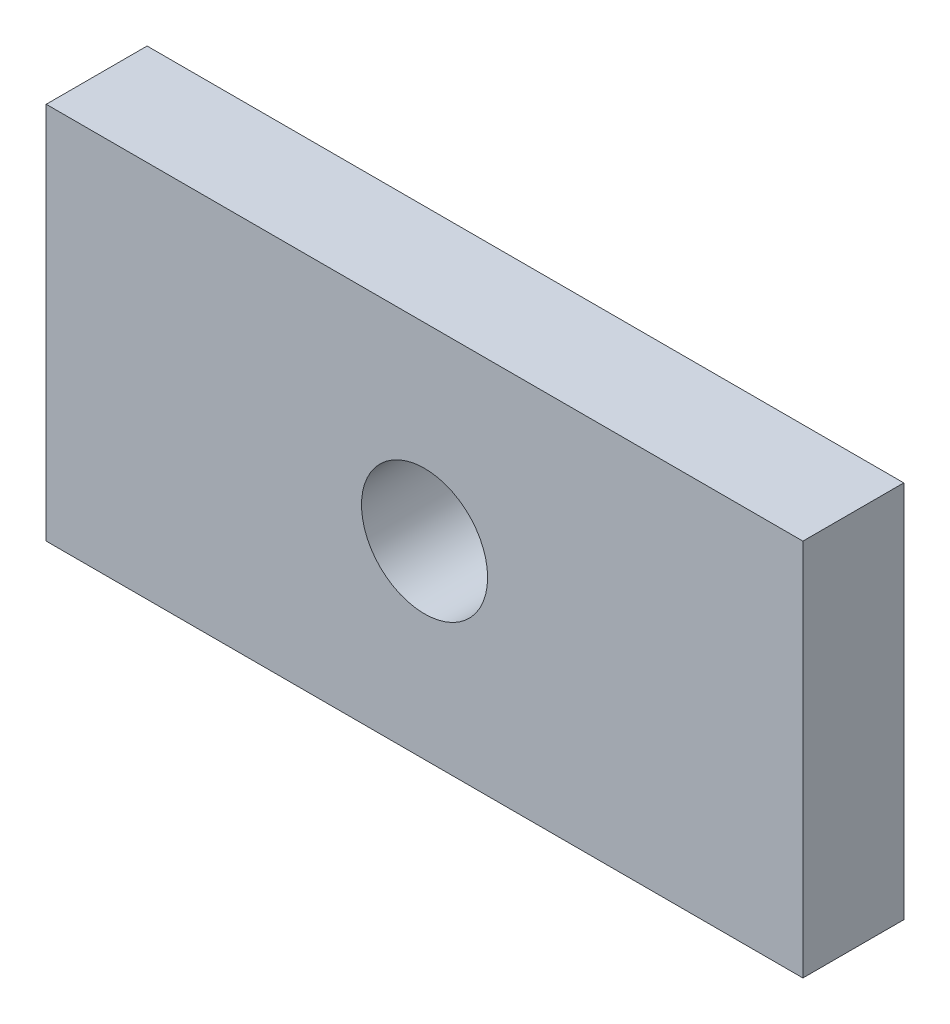
ISO-10303-21;
HEADER;
FILE_DESCRIPTION(('STEP AP214'),'2;1');
FILE_NAME('part.step','',(''),(''),'','','');
FILE_SCHEMA(('AUTOMOTIVE_DESIGN { 1 0 10303 214 1 1 1 1 }'));
ENDSEC;
DATA;
#1=APPLICATION_CONTEXT('core data for automotive mechanical design processes');
#2=APPLICATION_PROTOCOL_DEFINITION('international standard','automotive_design',2000,#1);
#3=PRODUCT_CONTEXT('',#1,'mechanical');
#4=PRODUCT('Part','Part','',(#3));
#5=PRODUCT_RELATED_PRODUCT_CATEGORY('part','',(#4));
#6=PRODUCT_DEFINITION_FORMATION('','',#4);
#7=PRODUCT_DEFINITION_CONTEXT('part definition',#1,'design');
#8=PRODUCT_DEFINITION('design','',#6,#7);
#9=PRODUCT_DEFINITION_SHAPE('','',#8);
#10=(LENGTH_UNIT() NAMED_UNIT(*) SI_UNIT(.MILLI.,.METRE.));
#11=(NAMED_UNIT(*) PLANE_ANGLE_UNIT() SI_UNIT($,.RADIAN.));
#12=(NAMED_UNIT(*) SI_UNIT($,.STERADIAN.) SOLID_ANGLE_UNIT());
#13=UNCERTAINTY_MEASURE_WITH_UNIT(LENGTH_MEASURE(1.E-05),#10,'distance_accuracy_value','');
#14=(GEOMETRIC_REPRESENTATION_CONTEXT(3) GLOBAL_UNCERTAINTY_ASSIGNED_CONTEXT((#13)) GLOBAL_UNIT_ASSIGNED_CONTEXT((#10,
#11,#12)) REPRESENTATION_CONTEXT('',''));
#15=CARTESIAN_POINT('',(0.,0.,0.));
#16=DIRECTION('',(0.,0.,1.));
#17=DIRECTION('',(1.,0.,0.));
#18=AXIS2_PLACEMENT_3D('',#15,#16,#17);
#19=CARTESIAN_POINT('',(150.,-75.,40.));
#20=DIRECTION('',(-1.,0.,0.));
#21=DIRECTION('',(0.,0.,1.));
#22=AXIS2_PLACEMENT_3D('',#19,#20,#21);
#23=PLANE('',#22);
#24=DIRECTION('',(0.,1.,0.));
#25=VECTOR('',#24,1.);
#26=CARTESIAN_POINT('',(150.,-75.,0.));
#27=LINE('',#26,#25);
#28=CARTESIAN_POINT('',(150.,-75.,0.));
#29=VERTEX_POINT('',#28);
#30=CARTESIAN_POINT('',(150.,75.,0.));
#31=VERTEX_POINT('',#30);
#32=EDGE_CURVE('E101',#29,#31,#27,.T.);
#33=ORIENTED_EDGE('',*,*,#32,.T.);
#34=DIRECTION('',(0.,0.,-1.));
#35=VECTOR('',#34,1.);
#36=CARTESIAN_POINT('',(150.,75.,40.));
#37=LINE('',#36,#35);
#38=CARTESIAN_POINT('',(150.,75.,40.));
#39=VERTEX_POINT('',#38);
#40=EDGE_CURVE('E11',#39,#31,#37,.T.);
#41=ORIENTED_EDGE('',*,*,#40,.F.);
#42=DIRECTION('',(0.,1.,0.));
#43=VECTOR('',#42,1.);
#44=CARTESIAN_POINT('',(150.,-75.,40.));
#45=LINE('',#44,#43);
#46=CARTESIAN_POINT('',(150.,-75.,40.));
#47=VERTEX_POINT('',#46);
#48=EDGE_CURVE('E89',#47,#39,#45,.T.);
#49=ORIENTED_EDGE('',*,*,#48,.F.);
#50=DIRECTION('',(0.,0.,-1.));
#51=VECTOR('',#50,1.);
#52=CARTESIAN_POINT('',(150.,-75.,40.));
#53=LINE('',#52,#51);
#54=EDGE_CURVE('E97',#47,#29,#53,.T.);
#55=ORIENTED_EDGE('',*,*,#54,.T.);
#56=EDGE_LOOP('',(#33,#41,#49,#55));
#57=FACE_BOUND('',#56,.T.);
#58=ADVANCED_FACE('F38',(#57),#23,.F.);
#59=CARTESIAN_POINT('',(-150.,75.,40.));
#60=DIRECTION('',(0.,-1.,0.));
#61=DIRECTION('',(0.,0.,-1.));
#62=AXIS2_PLACEMENT_3D('',#59,#60,#61);
#63=PLANE('',#62);
#64=DIRECTION('',(-1.,0.,0.));
#65=VECTOR('',#64,1.);
#66=CARTESIAN_POINT('',(-150.,75.,0.));
#67=LINE('',#66,#65);
#68=CARTESIAN_POINT('',(-150.,75.,0.));
#69=VERTEX_POINT('',#68);
#70=EDGE_CURVE('E93',#31,#69,#67,.T.);
#71=ORIENTED_EDGE('',*,*,#70,.T.);
#72=DIRECTION('',(0.,0.,-1.));
#73=VECTOR('',#72,1.);
#74=CARTESIAN_POINT('',(-150.,75.,40.));
#75=LINE('',#74,#73);
#76=CARTESIAN_POINT('',(-150.,75.,40.));
#77=VERTEX_POINT('',#76);
#78=EDGE_CURVE('E46',#77,#69,#75,.T.);
#79=ORIENTED_EDGE('',*,*,#78,.F.);
#80=DIRECTION('',(-1.,0.,0.));
#81=VECTOR('',#80,1.);
#82=CARTESIAN_POINT('',(-150.,75.,40.));
#83=LINE('',#82,#81);
#84=EDGE_CURVE('E84',#39,#77,#83,.T.);
#85=ORIENTED_EDGE('',*,*,#84,.F.);
#86=ORIENTED_EDGE('',*,*,#40,.T.);
#87=EDGE_LOOP('',(#71,#79,#85,#86));
#88=FACE_BOUND('',#87,.T.);
#89=ADVANCED_FACE('F92',(#88),#63,.F.);
#90=CARTESIAN_POINT('',(-150.,-75.,40.));
#91=DIRECTION('',(1.,0.,0.));
#92=DIRECTION('',(0.,0.,-1.));
#93=AXIS2_PLACEMENT_3D('',#90,#91,#92);
#94=PLANE('',#93);
#95=DIRECTION('',(0.,-1.,0.));
#96=VECTOR('',#95,1.);
#97=CARTESIAN_POINT('',(-150.,-75.,0.));
#98=LINE('',#97,#96);
#99=CARTESIAN_POINT('',(-150.,-75.,0.));
#100=VERTEX_POINT('',#99);
#101=EDGE_CURVE('E71',#69,#100,#98,.T.);
#102=ORIENTED_EDGE('',*,*,#101,.T.);
#103=DIRECTION('',(0.,0.,-1.));
#104=VECTOR('',#103,1.);
#105=CARTESIAN_POINT('',(-150.,-75.,40.));
#106=LINE('',#105,#104);
#107=CARTESIAN_POINT('',(-150.,-75.,40.));
#108=VERTEX_POINT('',#107);
#109=EDGE_CURVE('E94',#108,#100,#106,.T.);
#110=ORIENTED_EDGE('',*,*,#109,.F.);
#111=DIRECTION('',(0.,-1.,0.));
#112=VECTOR('',#111,1.);
#113=CARTESIAN_POINT('',(-150.,-75.,40.));
#114=LINE('',#113,#112);
#115=EDGE_CURVE('E87',#77,#108,#114,.T.);
#116=ORIENTED_EDGE('',*,*,#115,.F.);
#117=ORIENTED_EDGE('',*,*,#78,.T.);
#118=EDGE_LOOP('',(#102,#110,#116,#117));
#119=FACE_BOUND('',#118,.T.);
#120=ADVANCED_FACE('F95',(#119),#94,.F.);
#121=CARTESIAN_POINT('',(-150.,-75.,40.));
#122=DIRECTION('',(0.,1.,0.));
#123=DIRECTION('',(0.,0.,1.));
#124=AXIS2_PLACEMENT_3D('',#121,#122,#123);
#125=PLANE('',#124);
#126=DIRECTION('',(1.,0.,0.));
#127=VECTOR('',#126,1.);
#128=CARTESIAN_POINT('',(-150.,-75.,0.));
#129=LINE('',#128,#127);
#130=EDGE_CURVE('E77',#100,#29,#129,.T.);
#131=ORIENTED_EDGE('',*,*,#130,.T.);
#132=ORIENTED_EDGE('',*,*,#54,.F.);
#133=DIRECTION('',(1.,0.,0.));
#134=VECTOR('',#133,1.);
#135=CARTESIAN_POINT('',(-150.,-75.,40.));
#136=LINE('',#135,#134);
#137=EDGE_CURVE('E54',#108,#47,#136,.T.);
#138=ORIENTED_EDGE('',*,*,#137,.F.);
#139=ORIENTED_EDGE('',*,*,#109,.T.);
#140=EDGE_LOOP('',(#131,#132,#138,#139));
#141=FACE_BOUND('',#140,.T.);
#142=ADVANCED_FACE('F109',(#141),#125,.F.);
#143=CARTESIAN_POINT('',(0.,0.,40.));
#144=DIRECTION('',(0.,0.,-1.));
#145=DIRECTION('',(-1.,0.,0.));
#146=AXIS2_PLACEMENT_3D('',#143,#144,#145);
#147=PLANE('',#146);
#148=CARTESIAN_POINT('',(0.,0.,40.));
#149=DIRECTION('',(0.,0.,1.));
#150=DIRECTION('',(1.,0.,0.));
#151=AXIS2_PLACEMENT_3D('',#148,#149,#150);
#152=CIRCLE('',#151,25.);
#153=CARTESIAN_POINT('',(25.,0.,40.));
#154=VERTEX_POINT('',#153);
#155=EDGE_CURVE('E115',#154,#154,#152,.T.);
#156=ORIENTED_EDGE('',*,*,#155,.F.);
#157=EDGE_LOOP('',(#156));
#158=FACE_BOUND('',#157,.T.);
#159=ORIENTED_EDGE('',*,*,#48,.T.);
#160=ORIENTED_EDGE('',*,*,#84,.T.);
#161=ORIENTED_EDGE('',*,*,#115,.T.);
#162=ORIENTED_EDGE('',*,*,#137,.T.);
#163=EDGE_LOOP('',(#159,#160,#161,#162));
#164=FACE_BOUND('',#163,.T.);
#165=ADVANCED_FACE('F85',(#158,#164),#147,.F.);
#166=CARTESIAN_POINT('',(0.,0.,0.));
#167=DIRECTION('',(0.,0.,-1.));
#168=DIRECTION('',(-1.,0.,0.));
#169=AXIS2_PLACEMENT_3D('',#166,#167,#168);
#170=PLANE('',#169);
#171=CARTESIAN_POINT('',(0.,0.,0.));
#172=DIRECTION('',(0.,0.,1.));
#173=DIRECTION('',(1.,0.,0.));
#174=AXIS2_PLACEMENT_3D('',#171,#172,#173);
#175=CIRCLE('',#174,25.);
#176=CARTESIAN_POINT('',(25.,0.,0.));
#177=VERTEX_POINT('',#176);
#178=EDGE_CURVE('E104',#177,#177,#175,.T.);
#179=ORIENTED_EDGE('',*,*,#178,.T.);
#180=EDGE_LOOP('',(#179));
#181=FACE_BOUND('',#180,.T.);
#182=ORIENTED_EDGE('',*,*,#32,.F.);
#183=ORIENTED_EDGE('',*,*,#130,.F.);
#184=ORIENTED_EDGE('',*,*,#101,.F.);
#185=ORIENTED_EDGE('',*,*,#70,.F.);
#186=EDGE_LOOP('',(#182,#183,#184,#185));
#187=FACE_BOUND('',#186,.T.);
#188=ADVANCED_FACE('F112',(#181,#187),#170,.T.);
#189=CARTESIAN_POINT('',(0.,0.,0.));
#190=DIRECTION('',(0.,0.,1.));
#191=DIRECTION('',(1.,0.,0.));
#192=AXIS2_PLACEMENT_3D('',#189,#190,#191);
#193=CYLINDRICAL_SURFACE('',#192,25.);
#194=ORIENTED_EDGE('',*,*,#178,.F.);
#195=EDGE_LOOP('',(#194));
#196=FACE_BOUND('',#195,.T.);
#197=ORIENTED_EDGE('',*,*,#155,.T.);
#198=EDGE_LOOP('',(#197));
#199=FACE_BOUND('',#198,.T.);
#200=ADVANCED_FACE('F122',(#196,#199),#193,.F.);
#201=CLOSED_SHELL('',(#58,#89,#120,#142,#165,#188,#200));
#202=MANIFOLD_SOLID_BREP('B2',#201);
#203=ADVANCED_BREP_SHAPE_REPRESENTATION('',(#18,#202),#14);
#204=SHAPE_DEFINITION_REPRESENTATION(#9,#203);
ENDSEC;
END-ISO-10303-21;
